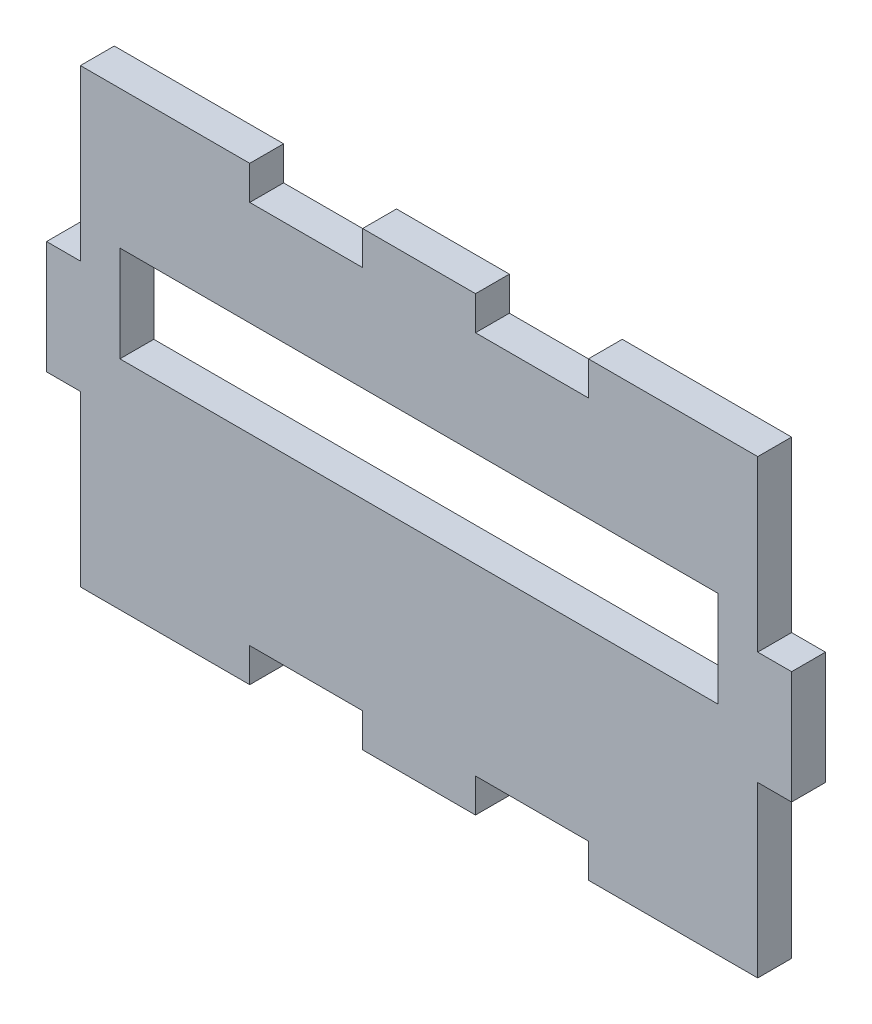
ISO-10303-21;
HEADER;
FILE_DESCRIPTION(('STEP AP214'),'2;1');
FILE_NAME('part.step','',(''),(''),'','','');
FILE_SCHEMA(('AUTOMOTIVE_DESIGN { 1 0 10303 214 1 1 1 1 }'));
ENDSEC;
DATA;
#1=APPLICATION_CONTEXT('core data for automotive mechanical design processes');
#2=APPLICATION_PROTOCOL_DEFINITION('international standard','automotive_design',2000,#1);
#3=PRODUCT_CONTEXT('',#1,'mechanical');
#4=PRODUCT('Part','Part','',(#3));
#5=PRODUCT_RELATED_PRODUCT_CATEGORY('part','',(#4));
#6=PRODUCT_DEFINITION_FORMATION('','',#4);
#7=PRODUCT_DEFINITION_CONTEXT('part definition',#1,'design');
#8=PRODUCT_DEFINITION('design','',#6,#7);
#9=PRODUCT_DEFINITION_SHAPE('','',#8);
#10=(LENGTH_UNIT() NAMED_UNIT(*) SI_UNIT(.MILLI.,.METRE.));
#11=(NAMED_UNIT(*) PLANE_ANGLE_UNIT() SI_UNIT($,.RADIAN.));
#12=(NAMED_UNIT(*) SI_UNIT($,.STERADIAN.) SOLID_ANGLE_UNIT());
#13=UNCERTAINTY_MEASURE_WITH_UNIT(LENGTH_MEASURE(1.E-05),#10,'distance_accuracy_value','');
#14=(GEOMETRIC_REPRESENTATION_CONTEXT(3) GLOBAL_UNCERTAINTY_ASSIGNED_CONTEXT((#13)) GLOBAL_UNIT_ASSIGNED_CONTEXT((#10,
#11,#12)) REPRESENTATION_CONTEXT('',''));
#15=CARTESIAN_POINT('',(0.,0.,0.));
#16=DIRECTION('',(0.,0.,1.));
#17=DIRECTION('',(1.,0.,0.));
#18=AXIS2_PLACEMENT_3D('',#15,#16,#17);
#19=CARTESIAN_POINT('',(0.,0.,6.));
#20=DIRECTION('',(0.,0.,1.));
#21=DIRECTION('',(1.,0.,0.));
#22=AXIS2_PLACEMENT_3D('',#19,#20,#21);
#23=PLANE('',#22);
#24=DIRECTION('',(1.,0.,0.));
#25=VECTOR('',#24,1.);
#26=CARTESIAN_POINT('',(0.,0.,6.));
#27=LINE('',#26,#25);
#28=CARTESIAN_POINT('',(-30.0000752126141,0.,6.));
#29=VERTEX_POINT('',#28);
#30=CARTESIAN_POINT('',(0.,0.,6.));
#31=VERTEX_POINT('',#30);
#32=EDGE_CURVE('E278',#29,#31,#27,.T.);
#33=ORIENTED_EDGE('',*,*,#32,.T.);
#34=DIRECTION('',(0.,1.,0.));
#35=VECTOR('',#34,1.);
#36=CARTESIAN_POINT('',(0.,0.,6.));
#37=LINE('',#36,#35);
#38=CARTESIAN_POINT('',(0.,30.,6.));
#39=VERTEX_POINT('',#38);
#40=EDGE_CURVE('E281',#31,#39,#37,.T.);
#41=ORIENTED_EDGE('',*,*,#40,.T.);
#42=DIRECTION('',(1.,0.,0.));
#43=VECTOR('',#42,1.);
#44=CARTESIAN_POINT('',(5.99999999999999,30.,6.));
#45=LINE('',#44,#43);
#46=CARTESIAN_POINT('',(5.99999999999999,30.,6.));
#47=VERTEX_POINT('',#46);
#48=EDGE_CURVE('E284',#39,#47,#45,.T.);
#49=ORIENTED_EDGE('',*,*,#48,.T.);
#50=DIRECTION('',(0.,1.,0.));
#51=VECTOR('',#50,1.);
#52=CARTESIAN_POINT('',(5.99999999999999,50.,6.));
#53=LINE('',#52,#51);
#54=CARTESIAN_POINT('',(5.99999999999999,50.,6.));
#55=VERTEX_POINT('',#54);
#56=EDGE_CURVE('E286',#47,#55,#53,.T.);
#57=ORIENTED_EDGE('',*,*,#56,.T.);
#58=DIRECTION('',(-1.,0.,0.));
#59=VECTOR('',#58,1.);
#60=CARTESIAN_POINT('',(0.,50.,6.));
#61=LINE('',#60,#59);
#62=CARTESIAN_POINT('',(0.,50.,6.));
#63=VERTEX_POINT('',#62);
#64=EDGE_CURVE('E288',#55,#63,#61,.T.);
#65=ORIENTED_EDGE('',*,*,#64,.T.);
#66=DIRECTION('',(0.,1.,0.));
#67=VECTOR('',#66,1.);
#68=CARTESIAN_POINT('',(0.,50.,6.));
#69=LINE('',#68,#67);
#70=CARTESIAN_POINT('',(0.,80.,6.));
#71=VERTEX_POINT('',#70);
#72=EDGE_CURVE('E290',#63,#71,#69,.T.);
#73=ORIENTED_EDGE('',*,*,#72,.T.);
#74=DIRECTION('',(-1.,0.,0.));
#75=VECTOR('',#74,1.);
#76=CARTESIAN_POINT('',(0.,80.,6.));
#77=LINE('',#76,#75);
#78=CARTESIAN_POINT('',(-30.0000005839988,80.,6.));
#79=VERTEX_POINT('',#78);
#80=EDGE_CURVE('E292',#71,#79,#77,.T.);
#81=ORIENTED_EDGE('',*,*,#80,.T.);
#82=DIRECTION('',(0.,-1.,0.));
#83=VECTOR('',#82,1.);
#84=CARTESIAN_POINT('',(-30.0000005839988,74.,6.));
#85=LINE('',#84,#83);
#86=CARTESIAN_POINT('',(-30.0000005839988,74.,6.));
#87=VERTEX_POINT('',#86);
#88=EDGE_CURVE('E294',#79,#87,#85,.T.);
#89=ORIENTED_EDGE('',*,*,#88,.T.);
#90=DIRECTION('',(-1.,0.,0.));
#91=VECTOR('',#90,1.);
#92=CARTESIAN_POINT('',(-50.0000005839988,74.,6.));
#93=LINE('',#92,#91);
#94=CARTESIAN_POINT('',(-50.0000005839988,74.,6.));
#95=VERTEX_POINT('',#94);
#96=EDGE_CURVE('E296',#87,#95,#93,.T.);
#97=ORIENTED_EDGE('',*,*,#96,.T.);
#98=DIRECTION('',(9.73331288252792E-08,0.999999999999995,0.));
#99=VECTOR('',#98,1.);
#100=CARTESIAN_POINT('',(-50.,80.,6.));
#101=LINE('',#100,#99);
#102=CARTESIAN_POINT('',(-50.,80.,6.));
#103=VERTEX_POINT('',#102);
#104=EDGE_CURVE('E298',#95,#103,#101,.T.);
#105=ORIENTED_EDGE('',*,*,#104,.T.);
#106=DIRECTION('',(-1.,0.,0.));
#107=VECTOR('',#106,1.);
#108=CARTESIAN_POINT('',(-50.,80.,6.));
#109=LINE('',#108,#107);
#110=CARTESIAN_POINT('',(-70.,80.,6.));
#111=VERTEX_POINT('',#110);
#112=EDGE_CURVE('E300',#103,#111,#109,.T.);
#113=ORIENTED_EDGE('',*,*,#112,.T.);
#114=DIRECTION('',(0.,-1.,0.));
#115=VECTOR('',#114,1.);
#116=CARTESIAN_POINT('',(-70.,74.,6.));
#117=LINE('',#116,#115);
#118=CARTESIAN_POINT('',(-70.,74.,6.));
#119=VERTEX_POINT('',#118);
#120=EDGE_CURVE('E302',#111,#119,#117,.T.);
#121=ORIENTED_EDGE('',*,*,#120,.T.);
#122=DIRECTION('',(-1.,0.,0.));
#123=VECTOR('',#122,1.);
#124=CARTESIAN_POINT('',(-90.,74.,6.));
#125=LINE('',#124,#123);
#126=CARTESIAN_POINT('',(-90.,74.,6.));
#127=VERTEX_POINT('',#126);
#128=EDGE_CURVE('E304',#119,#127,#125,.T.);
#129=ORIENTED_EDGE('',*,*,#128,.T.);
#130=DIRECTION('',(9.73331299817613E-08,0.999999999999995,0.));
#131=VECTOR('',#130,1.);
#132=CARTESIAN_POINT('',(-89.9999994160012,80.,6.));
#133=LINE('',#132,#131);
#134=CARTESIAN_POINT('',(-89.9999994160012,80.,6.));
#135=VERTEX_POINT('',#134);
#136=EDGE_CURVE('E306',#127,#135,#133,.T.);
#137=ORIENTED_EDGE('',*,*,#136,.T.);
#138=DIRECTION('',(-1.,0.,0.));
#139=VECTOR('',#138,1.);
#140=CARTESIAN_POINT('',(-89.9999994160012,80.,6.));
#141=LINE('',#140,#139);
#142=CARTESIAN_POINT('',(-120.,80.,6.));
#143=VERTEX_POINT('',#142);
#144=EDGE_CURVE('E308',#135,#143,#141,.T.);
#145=ORIENTED_EDGE('',*,*,#144,.T.);
#146=DIRECTION('',(0.,-1.,0.));
#147=VECTOR('',#146,1.);
#148=CARTESIAN_POINT('',(-120.,50.,6.));
#149=LINE('',#148,#147);
#150=CARTESIAN_POINT('',(-120.,50.,6.));
#151=VERTEX_POINT('',#150);
#152=EDGE_CURVE('E310',#143,#151,#149,.T.);
#153=ORIENTED_EDGE('',*,*,#152,.T.);
#154=DIRECTION('',(-1.,0.,0.));
#155=VECTOR('',#154,1.);
#156=CARTESIAN_POINT('',(-120.,50.,6.));
#157=LINE('',#156,#155);
#158=CARTESIAN_POINT('',(-126.,50.,6.));
#159=VERTEX_POINT('',#158);
#160=EDGE_CURVE('E312',#151,#159,#157,.T.);
#161=ORIENTED_EDGE('',*,*,#160,.T.);
#162=DIRECTION('',(0.,-1.,0.));
#163=VECTOR('',#162,1.);
#164=CARTESIAN_POINT('',(-126.,50.,6.));
#165=LINE('',#164,#163);
#166=CARTESIAN_POINT('',(-126.,30.,6.));
#167=VERTEX_POINT('',#166);
#168=EDGE_CURVE('E314',#159,#167,#165,.T.);
#169=ORIENTED_EDGE('',*,*,#168,.T.);
#170=DIRECTION('',(1.,0.,0.));
#171=VECTOR('',#170,1.);
#172=CARTESIAN_POINT('',(-126.,30.,6.));
#173=LINE('',#172,#171);
#174=CARTESIAN_POINT('',(-120.,30.,6.));
#175=VERTEX_POINT('',#174);
#176=EDGE_CURVE('E316',#167,#175,#173,.T.);
#177=ORIENTED_EDGE('',*,*,#176,.T.);
#178=DIRECTION('',(0.,-1.,0.));
#179=VECTOR('',#178,1.);
#180=CARTESIAN_POINT('',(-120.,0.,6.));
#181=LINE('',#180,#179);
#182=CARTESIAN_POINT('',(-120.,0.,6.));
#183=VERTEX_POINT('',#182);
#184=EDGE_CURVE('E318',#175,#183,#181,.T.);
#185=ORIENTED_EDGE('',*,*,#184,.T.);
#186=DIRECTION('',(1.,0.,0.));
#187=VECTOR('',#186,1.);
#188=CARTESIAN_POINT('',(-89.9999994160012,0.,6.));
#189=LINE('',#188,#187);
#190=CARTESIAN_POINT('',(-89.9999994160012,0.,6.));
#191=VERTEX_POINT('',#190);
#192=EDGE_CURVE('E320',#183,#191,#189,.T.);
#193=ORIENTED_EDGE('',*,*,#192,.T.);
#194=DIRECTION('',(0.,1.,0.));
#195=VECTOR('',#194,1.);
#196=CARTESIAN_POINT('',(-89.9999994160012,0.,6.));
#197=LINE('',#196,#195);
#198=CARTESIAN_POINT('',(-89.9999994160012,5.99999999999999,6.));
#199=VERTEX_POINT('',#198);
#200=EDGE_CURVE('E322',#191,#199,#197,.T.);
#201=ORIENTED_EDGE('',*,*,#200,.T.);
#202=DIRECTION('',(1.,0.,0.));
#203=VECTOR('',#202,1.);
#204=CARTESIAN_POINT('',(-89.9999994160012,5.99999999999999,6.));
#205=LINE('',#204,#203);
#206=CARTESIAN_POINT('',(-69.9999994160012,5.99999999999999,6.));
#207=VERTEX_POINT('',#206);
#208=EDGE_CURVE('E324',#199,#207,#205,.T.);
#209=ORIENTED_EDGE('',*,*,#208,.T.);
#210=DIRECTION('',(0.,-1.,0.));
#211=VECTOR('',#210,1.);
#212=CARTESIAN_POINT('',(-69.9999994160012,5.99999999999999,6.));
#213=LINE('',#212,#211);
#214=CARTESIAN_POINT('',(-69.9999994160012,0.,6.));
#215=VERTEX_POINT('',#214);
#216=EDGE_CURVE('E326',#207,#215,#213,.T.);
#217=ORIENTED_EDGE('',*,*,#216,.T.);
#218=DIRECTION('',(1.,0.,0.));
#219=VECTOR('',#218,1.);
#220=CARTESIAN_POINT('',(-50.0000752126141,0.,6.));
#221=LINE('',#220,#219);
#222=CARTESIAN_POINT('',(-50.0000752126141,0.,6.));
#223=VERTEX_POINT('',#222);
#224=EDGE_CURVE('E328',#215,#223,#221,.T.);
#225=ORIENTED_EDGE('',*,*,#224,.T.);
#226=DIRECTION('',(0.,1.,0.));
#227=VECTOR('',#226,1.);
#228=CARTESIAN_POINT('',(-50.0000752126141,0.,6.));
#229=LINE('',#228,#227);
#230=CARTESIAN_POINT('',(-50.0000752126141,5.99999999999999,6.));
#231=VERTEX_POINT('',#230);
#232=EDGE_CURVE('E330',#223,#231,#229,.T.);
#233=ORIENTED_EDGE('',*,*,#232,.T.);
#234=DIRECTION('',(1.,0.,0.));
#235=VECTOR('',#234,1.);
#236=CARTESIAN_POINT('',(-50.0000752126141,5.99999999999999,6.));
#237=LINE('',#236,#235);
#238=CARTESIAN_POINT('',(-30.0000752126141,5.99999999999999,6.));
#239=VERTEX_POINT('',#238);
#240=EDGE_CURVE('E332',#231,#239,#237,.T.);
#241=ORIENTED_EDGE('',*,*,#240,.T.);
#242=DIRECTION('',(0.,-1.,0.));
#243=VECTOR('',#242,1.);
#244=CARTESIAN_POINT('',(-30.0000752126141,5.99999999999999,6.));
#245=LINE('',#244,#243);
#246=EDGE_CURVE('E334',#239,#29,#245,.T.);
#247=ORIENTED_EDGE('',*,*,#246,.T.);
#248=EDGE_LOOP('',(#33,#41,#49,#57,#65,#73,#81,#89,#97,#105,#113,#121,#129,#137,#145,#153,#161,
#169,#177,#185,#193,#201,#209,#217,#225,#233,#241,#247));
#249=FACE_BOUND('',#248,.T.);
#250=DIRECTION('',(1.,0.,0.));
#251=VECTOR('',#250,1.);
#252=CARTESIAN_POINT('',(-113.,38.5,6.));
#253=LINE('',#252,#251);
#254=CARTESIAN_POINT('',(-113.,38.5,6.));
#255=VERTEX_POINT('',#254);
#256=CARTESIAN_POINT('',(-6.99999999999998,38.5,6.));
#257=VERTEX_POINT('',#256);
#258=EDGE_CURVE('E250',#255,#257,#253,.T.);
#259=ORIENTED_EDGE('',*,*,#258,.F.);
#260=DIRECTION('',(0.,-1.,0.));
#261=VECTOR('',#260,1.);
#262=CARTESIAN_POINT('',(-113.,38.5,6.));
#263=LINE('',#262,#261);
#264=CARTESIAN_POINT('',(-113.,55.5,6.));
#265=VERTEX_POINT('',#264);
#266=EDGE_CURVE('E242',#265,#255,#263,.T.);
#267=ORIENTED_EDGE('',*,*,#266,.F.);
#268=DIRECTION('',(-1.,0.,0.));
#269=VECTOR('',#268,1.);
#270=CARTESIAN_POINT('',(-113.,55.5,6.));
#271=LINE('',#270,#269);
#272=CARTESIAN_POINT('',(-6.99999999999998,55.5,6.));
#273=VERTEX_POINT('',#272);
#274=EDGE_CURVE('E264',#273,#265,#271,.T.);
#275=ORIENTED_EDGE('',*,*,#274,.F.);
#276=DIRECTION('',(0.,1.,0.));
#277=VECTOR('',#276,1.);
#278=CARTESIAN_POINT('',(-6.99999999999998,38.5,6.));
#279=LINE('',#278,#277);
#280=EDGE_CURVE('E262',#257,#273,#279,.T.);
#281=ORIENTED_EDGE('',*,*,#280,.F.);
#282=EDGE_LOOP('',(#259,#267,#275,#281));
#283=FACE_BOUND('',#282,.T.);
#284=ADVANCED_FACE('F33',(#249,#283),#23,.T.);
#285=CARTESIAN_POINT('',(0.,0.,0.));
#286=DIRECTION('',(0.,0.,1.));
#287=DIRECTION('',(1.,0.,0.));
#288=AXIS2_PLACEMENT_3D('',#285,#286,#287);
#289=PLANE('',#288);
#290=DIRECTION('',(1.,0.,0.));
#291=VECTOR('',#290,1.);
#292=CARTESIAN_POINT('',(0.,0.,0.));
#293=LINE('',#292,#291);
#294=CARTESIAN_POINT('',(-30.0000752126141,0.,0.));
#295=VERTEX_POINT('',#294);
#296=CARTESIAN_POINT('',(0.,0.,0.));
#297=VERTEX_POINT('',#296);
#298=EDGE_CURVE('E258',#295,#297,#293,.T.);
#299=ORIENTED_EDGE('',*,*,#298,.F.);
#300=DIRECTION('',(0.,-1.,0.));
#301=VECTOR('',#300,1.);
#302=CARTESIAN_POINT('',(-30.0000752126141,5.99999999999999,0.));
#303=LINE('',#302,#301);
#304=CARTESIAN_POINT('',(-30.0000752126141,5.99999999999999,0.));
#305=VERTEX_POINT('',#304);
#306=EDGE_CURVE('E282',#305,#295,#303,.T.);
#307=ORIENTED_EDGE('',*,*,#306,.F.);
#308=DIRECTION('',(1.,0.,0.));
#309=VECTOR('',#308,1.);
#310=CARTESIAN_POINT('',(-50.0000752126141,5.99999999999999,0.));
#311=LINE('',#310,#309);
#312=CARTESIAN_POINT('',(-50.0000752126141,5.99999999999999,0.));
#313=VERTEX_POINT('',#312);
#314=EDGE_CURVE('E389',#313,#305,#311,.T.);
#315=ORIENTED_EDGE('',*,*,#314,.F.);
#316=DIRECTION('',(0.,1.,0.));
#317=VECTOR('',#316,1.);
#318=CARTESIAN_POINT('',(-50.0000752126141,0.,0.));
#319=LINE('',#318,#317);
#320=CARTESIAN_POINT('',(-50.0000752126141,0.,0.));
#321=VERTEX_POINT('',#320);
#322=EDGE_CURVE('E387',#321,#313,#319,.T.);
#323=ORIENTED_EDGE('',*,*,#322,.F.);
#324=DIRECTION('',(1.,0.,0.));
#325=VECTOR('',#324,1.);
#326=CARTESIAN_POINT('',(-50.0000752126141,0.,0.));
#327=LINE('',#326,#325);
#328=CARTESIAN_POINT('',(-69.9999994160012,0.,0.));
#329=VERTEX_POINT('',#328);
#330=EDGE_CURVE('E385',#329,#321,#327,.T.);
#331=ORIENTED_EDGE('',*,*,#330,.F.);
#332=DIRECTION('',(0.,-1.,0.));
#333=VECTOR('',#332,1.);
#334=CARTESIAN_POINT('',(-69.9999994160012,5.99999999999999,0.));
#335=LINE('',#334,#333);
#336=CARTESIAN_POINT('',(-69.9999994160012,5.99999999999999,0.));
#337=VERTEX_POINT('',#336);
#338=EDGE_CURVE('E383',#337,#329,#335,.T.);
#339=ORIENTED_EDGE('',*,*,#338,.F.);
#340=DIRECTION('',(1.,0.,0.));
#341=VECTOR('',#340,1.);
#342=CARTESIAN_POINT('',(-89.9999994160012,5.99999999999999,0.));
#343=LINE('',#342,#341);
#344=CARTESIAN_POINT('',(-89.9999994160012,5.99999999999999,0.));
#345=VERTEX_POINT('',#344);
#346=EDGE_CURVE('E381',#345,#337,#343,.T.);
#347=ORIENTED_EDGE('',*,*,#346,.F.);
#348=DIRECTION('',(0.,1.,0.));
#349=VECTOR('',#348,1.);
#350=CARTESIAN_POINT('',(-89.9999994160012,0.,0.));
#351=LINE('',#350,#349);
#352=CARTESIAN_POINT('',(-89.9999994160012,0.,0.));
#353=VERTEX_POINT('',#352);
#354=EDGE_CURVE('E379',#353,#345,#351,.T.);
#355=ORIENTED_EDGE('',*,*,#354,.F.);
#356=DIRECTION('',(1.,0.,0.));
#357=VECTOR('',#356,1.);
#358=CARTESIAN_POINT('',(-89.9999994160012,0.,0.));
#359=LINE('',#358,#357);
#360=CARTESIAN_POINT('',(-120.,0.,0.));
#361=VERTEX_POINT('',#360);
#362=EDGE_CURVE('E377',#361,#353,#359,.T.);
#363=ORIENTED_EDGE('',*,*,#362,.F.);
#364=DIRECTION('',(0.,-1.,0.));
#365=VECTOR('',#364,1.);
#366=CARTESIAN_POINT('',(-120.,0.,0.));
#367=LINE('',#366,#365);
#368=CARTESIAN_POINT('',(-120.,30.,0.));
#369=VERTEX_POINT('',#368);
#370=EDGE_CURVE('E375',#369,#361,#367,.T.);
#371=ORIENTED_EDGE('',*,*,#370,.F.);
#372=DIRECTION('',(1.,0.,0.));
#373=VECTOR('',#372,1.);
#374=CARTESIAN_POINT('',(-126.,30.,0.));
#375=LINE('',#374,#373);
#376=CARTESIAN_POINT('',(-126.,30.,0.));
#377=VERTEX_POINT('',#376);
#378=EDGE_CURVE('E373',#377,#369,#375,.T.);
#379=ORIENTED_EDGE('',*,*,#378,.F.);
#380=DIRECTION('',(0.,-1.,0.));
#381=VECTOR('',#380,1.);
#382=CARTESIAN_POINT('',(-126.,50.,0.));
#383=LINE('',#382,#381);
#384=CARTESIAN_POINT('',(-126.,50.,0.));
#385=VERTEX_POINT('',#384);
#386=EDGE_CURVE('E371',#385,#377,#383,.T.);
#387=ORIENTED_EDGE('',*,*,#386,.F.);
#388=DIRECTION('',(-1.,0.,0.));
#389=VECTOR('',#388,1.);
#390=CARTESIAN_POINT('',(-120.,50.,0.));
#391=LINE('',#390,#389);
#392=CARTESIAN_POINT('',(-120.,50.,0.));
#393=VERTEX_POINT('',#392);
#394=EDGE_CURVE('E369',#393,#385,#391,.T.);
#395=ORIENTED_EDGE('',*,*,#394,.F.);
#396=DIRECTION('',(0.,-1.,0.));
#397=VECTOR('',#396,1.);
#398=CARTESIAN_POINT('',(-120.,50.,0.));
#399=LINE('',#398,#397);
#400=CARTESIAN_POINT('',(-120.,80.,0.));
#401=VERTEX_POINT('',#400);
#402=EDGE_CURVE('E367',#401,#393,#399,.T.);
#403=ORIENTED_EDGE('',*,*,#402,.F.);
#404=DIRECTION('',(-1.,0.,0.));
#405=VECTOR('',#404,1.);
#406=CARTESIAN_POINT('',(-89.9999994160012,80.,0.));
#407=LINE('',#406,#405);
#408=CARTESIAN_POINT('',(-89.9999994160012,80.,0.));
#409=VERTEX_POINT('',#408);
#410=EDGE_CURVE('E365',#409,#401,#407,.T.);
#411=ORIENTED_EDGE('',*,*,#410,.F.);
#412=DIRECTION('',(9.73331299817613E-08,0.999999999999995,0.));
#413=VECTOR('',#412,1.);
#414=CARTESIAN_POINT('',(-89.9999994160012,80.,0.));
#415=LINE('',#414,#413);
#416=CARTESIAN_POINT('',(-90.,74.,0.));
#417=VERTEX_POINT('',#416);
#418=EDGE_CURVE('E363',#417,#409,#415,.T.);
#419=ORIENTED_EDGE('',*,*,#418,.F.);
#420=DIRECTION('',(-1.,0.,0.));
#421=VECTOR('',#420,1.);
#422=CARTESIAN_POINT('',(-90.,74.,0.));
#423=LINE('',#422,#421);
#424=CARTESIAN_POINT('',(-70.,74.,0.));
#425=VERTEX_POINT('',#424);
#426=EDGE_CURVE('E361',#425,#417,#423,.T.);
#427=ORIENTED_EDGE('',*,*,#426,.F.);
#428=DIRECTION('',(0.,-1.,0.));
#429=VECTOR('',#428,1.);
#430=CARTESIAN_POINT('',(-70.,74.,0.));
#431=LINE('',#430,#429);
#432=CARTESIAN_POINT('',(-70.,80.,0.));
#433=VERTEX_POINT('',#432);
#434=EDGE_CURVE('E359',#433,#425,#431,.T.);
#435=ORIENTED_EDGE('',*,*,#434,.F.);
#436=DIRECTION('',(-1.,0.,0.));
#437=VECTOR('',#436,1.);
#438=CARTESIAN_POINT('',(-50.,80.,0.));
#439=LINE('',#438,#437);
#440=CARTESIAN_POINT('',(-50.,80.,0.));
#441=VERTEX_POINT('',#440);
#442=EDGE_CURVE('E357',#441,#433,#439,.T.);
#443=ORIENTED_EDGE('',*,*,#442,.F.);
#444=DIRECTION('',(9.73331288252792E-08,0.999999999999995,0.));
#445=VECTOR('',#444,1.);
#446=CARTESIAN_POINT('',(-50.,80.,0.));
#447=LINE('',#446,#445);
#448=CARTESIAN_POINT('',(-50.0000005839988,74.,0.));
#449=VERTEX_POINT('',#448);
#450=EDGE_CURVE('E355',#449,#441,#447,.T.);
#451=ORIENTED_EDGE('',*,*,#450,.F.);
#452=DIRECTION('',(-1.,0.,0.));
#453=VECTOR('',#452,1.);
#454=CARTESIAN_POINT('',(-50.0000005839988,74.,0.));
#455=LINE('',#454,#453);
#456=CARTESIAN_POINT('',(-30.0000005839988,74.,0.));
#457=VERTEX_POINT('',#456);
#458=EDGE_CURVE('E353',#457,#449,#455,.T.);
#459=ORIENTED_EDGE('',*,*,#458,.F.);
#460=DIRECTION('',(0.,-1.,0.));
#461=VECTOR('',#460,1.);
#462=CARTESIAN_POINT('',(-30.0000005839988,74.,0.));
#463=LINE('',#462,#461);
#464=CARTESIAN_POINT('',(-30.0000005839988,80.,0.));
#465=VERTEX_POINT('',#464);
#466=EDGE_CURVE('E351',#465,#457,#463,.T.);
#467=ORIENTED_EDGE('',*,*,#466,.F.);
#468=DIRECTION('',(-1.,0.,0.));
#469=VECTOR('',#468,1.);
#470=CARTESIAN_POINT('',(0.,80.,0.));
#471=LINE('',#470,#469);
#472=CARTESIAN_POINT('',(0.,80.,0.));
#473=VERTEX_POINT('',#472);
#474=EDGE_CURVE('E349',#473,#465,#471,.T.);
#475=ORIENTED_EDGE('',*,*,#474,.F.);
#476=DIRECTION('',(0.,1.,0.));
#477=VECTOR('',#476,1.);
#478=CARTESIAN_POINT('',(0.,50.,0.));
#479=LINE('',#478,#477);
#480=CARTESIAN_POINT('',(0.,50.,0.));
#481=VERTEX_POINT('',#480);
#482=EDGE_CURVE('E347',#481,#473,#479,.T.);
#483=ORIENTED_EDGE('',*,*,#482,.F.);
#484=DIRECTION('',(-1.,0.,0.));
#485=VECTOR('',#484,1.);
#486=CARTESIAN_POINT('',(0.,50.,0.));
#487=LINE('',#486,#485);
#488=CARTESIAN_POINT('',(5.99999999999999,50.,0.));
#489=VERTEX_POINT('',#488);
#490=EDGE_CURVE('E345',#489,#481,#487,.T.);
#491=ORIENTED_EDGE('',*,*,#490,.F.);
#492=DIRECTION('',(0.,1.,0.));
#493=VECTOR('',#492,1.);
#494=CARTESIAN_POINT('',(5.99999999999999,50.,0.));
#495=LINE('',#494,#493);
#496=CARTESIAN_POINT('',(5.99999999999999,30.,0.));
#497=VERTEX_POINT('',#496);
#498=EDGE_CURVE('E343',#497,#489,#495,.T.);
#499=ORIENTED_EDGE('',*,*,#498,.F.);
#500=DIRECTION('',(1.,0.,0.));
#501=VECTOR('',#500,1.);
#502=CARTESIAN_POINT('',(5.99999999999999,30.,0.));
#503=LINE('',#502,#501);
#504=CARTESIAN_POINT('',(0.,30.,0.));
#505=VERTEX_POINT('',#504);
#506=EDGE_CURVE('E341',#505,#497,#503,.T.);
#507=ORIENTED_EDGE('',*,*,#506,.F.);
#508=DIRECTION('',(0.,1.,0.));
#509=VECTOR('',#508,1.);
#510=CARTESIAN_POINT('',(0.,0.,0.));
#511=LINE('',#510,#509);
#512=EDGE_CURVE('E339',#297,#505,#511,.T.);
#513=ORIENTED_EDGE('',*,*,#512,.F.);
#514=EDGE_LOOP('',(#299,#307,#315,#323,#331,#339,#347,#355,#363,#371,#379,#387,#395,#403,#411,
#419,#427,#435,#443,#451,#459,#467,#475,#483,#491,#499,#507,#513));
#515=FACE_BOUND('',#514,.T.);
#516=DIRECTION('',(0.,-1.,0.));
#517=VECTOR('',#516,1.);
#518=CARTESIAN_POINT('',(-113.,38.5,0.));
#519=LINE('',#518,#517);
#520=CARTESIAN_POINT('',(-113.,55.5,0.));
#521=VERTEX_POINT('',#520);
#522=CARTESIAN_POINT('',(-113.,38.5,0.));
#523=VERTEX_POINT('',#522);
#524=EDGE_CURVE('E56',#521,#523,#519,.T.);
#525=ORIENTED_EDGE('',*,*,#524,.T.);
#526=DIRECTION('',(1.,0.,0.));
#527=VECTOR('',#526,1.);
#528=CARTESIAN_POINT('',(-113.,38.5,0.));
#529=LINE('',#528,#527);
#530=CARTESIAN_POINT('',(-6.99999999999998,38.5,0.));
#531=VERTEX_POINT('',#530);
#532=EDGE_CURVE('E257',#523,#531,#529,.T.);
#533=ORIENTED_EDGE('',*,*,#532,.T.);
#534=DIRECTION('',(0.,1.,0.));
#535=VECTOR('',#534,1.);
#536=CARTESIAN_POINT('',(-6.99999999999998,38.5,0.));
#537=LINE('',#536,#535);
#538=CARTESIAN_POINT('',(-6.99999999999998,55.5,0.));
#539=VERTEX_POINT('',#538);
#540=EDGE_CURVE('E270',#531,#539,#537,.T.);
#541=ORIENTED_EDGE('',*,*,#540,.T.);
#542=DIRECTION('',(-1.,0.,0.));
#543=VECTOR('',#542,1.);
#544=CARTESIAN_POINT('',(-113.,55.5,0.));
#545=LINE('',#544,#543);
#546=EDGE_CURVE('E251',#539,#521,#545,.T.);
#547=ORIENTED_EDGE('',*,*,#546,.T.);
#548=EDGE_LOOP('',(#525,#533,#541,#547));
#549=FACE_BOUND('',#548,.T.);
#550=ADVANCED_FACE('F479',(#515,#549),#289,.F.);
#551=CARTESIAN_POINT('',(0.,0.,6.));
#552=DIRECTION('',(0.,1.,0.));
#553=DIRECTION('',(-1.,0.,0.));
#554=AXIS2_PLACEMENT_3D('',#551,#552,#553);
#555=PLANE('',#554);
#556=ORIENTED_EDGE('',*,*,#298,.T.);
#557=DIRECTION('',(0.,0.,-1.));
#558=VECTOR('',#557,1.);
#559=CARTESIAN_POINT('',(0.,0.,6.));
#560=LINE('',#559,#558);
#561=EDGE_CURVE('E11',#31,#297,#560,.T.);
#562=ORIENTED_EDGE('',*,*,#561,.F.);
#563=ORIENTED_EDGE('',*,*,#32,.F.);
#564=DIRECTION('',(0.,0.,-1.));
#565=VECTOR('',#564,1.);
#566=CARTESIAN_POINT('',(-30.0000752126141,0.,6.));
#567=LINE('',#566,#565);
#568=EDGE_CURVE('E336',#29,#295,#567,.T.);
#569=ORIENTED_EDGE('',*,*,#568,.T.);
#570=EDGE_LOOP('',(#556,#562,#563,#569));
#571=FACE_BOUND('',#570,.T.);
#572=ADVANCED_FACE('F35',(#571),#555,.F.);
#573=CARTESIAN_POINT('',(0.,0.,6.));
#574=DIRECTION('',(-1.,0.,0.));
#575=DIRECTION('',(0.,0.,1.));
#576=AXIS2_PLACEMENT_3D('',#573,#574,#575);
#577=PLANE('',#576);
#578=ORIENTED_EDGE('',*,*,#512,.T.);
#579=DIRECTION('',(0.,0.,-1.));
#580=VECTOR('',#579,1.);
#581=CARTESIAN_POINT('',(0.,30.,6.));
#582=LINE('',#581,#580);
#583=EDGE_CURVE('E41',#39,#505,#582,.T.);
#584=ORIENTED_EDGE('',*,*,#583,.F.);
#585=ORIENTED_EDGE('',*,*,#40,.F.);
#586=ORIENTED_EDGE('',*,*,#561,.T.);
#587=EDGE_LOOP('',(#578,#584,#585,#586));
#588=FACE_BOUND('',#587,.T.);
#589=ADVANCED_FACE('F496',(#588),#577,.F.);
#590=CARTESIAN_POINT('',(5.99999999999999,30.,6.));
#591=DIRECTION('',(0.,1.,0.));
#592=DIRECTION('',(-1.,0.,0.));
#593=AXIS2_PLACEMENT_3D('',#590,#591,#592);
#594=PLANE('',#593);
#595=ORIENTED_EDGE('',*,*,#506,.T.);
#596=DIRECTION('',(0.,0.,-1.));
#597=VECTOR('',#596,1.);
#598=CARTESIAN_POINT('',(5.99999999999999,30.,6.));
#599=LINE('',#598,#597);
#600=EDGE_CURVE('E466',#47,#497,#599,.T.);
#601=ORIENTED_EDGE('',*,*,#600,.F.);
#602=ORIENTED_EDGE('',*,*,#48,.F.);
#603=ORIENTED_EDGE('',*,*,#583,.T.);
#604=EDGE_LOOP('',(#595,#601,#602,#603));
#605=FACE_BOUND('',#604,.T.);
#606=ADVANCED_FACE('F473',(#605),#594,.F.);
#607=CARTESIAN_POINT('',(5.99999999999999,50.,6.));
#608=DIRECTION('',(-1.,0.,0.));
#609=DIRECTION('',(0.,0.,1.));
#610=AXIS2_PLACEMENT_3D('',#607,#608,#609);
#611=PLANE('',#610);
#612=ORIENTED_EDGE('',*,*,#498,.T.);
#613=DIRECTION('',(0.,0.,-1.));
#614=VECTOR('',#613,1.);
#615=CARTESIAN_POINT('',(5.99999999999999,50.,6.));
#616=LINE('',#615,#614);
#617=EDGE_CURVE('E463',#55,#489,#616,.T.);
#618=ORIENTED_EDGE('',*,*,#617,.F.);
#619=ORIENTED_EDGE('',*,*,#56,.F.);
#620=ORIENTED_EDGE('',*,*,#600,.T.);
#621=EDGE_LOOP('',(#612,#618,#619,#620));
#622=FACE_BOUND('',#621,.T.);
#623=ADVANCED_FACE('F485',(#622),#611,.F.);
#624=CARTESIAN_POINT('',(0.,50.,6.));
#625=DIRECTION('',(0.,-1.,0.));
#626=DIRECTION('',(1.,0.,0.));
#627=AXIS2_PLACEMENT_3D('',#624,#625,#626);
#628=PLANE('',#627);
#629=ORIENTED_EDGE('',*,*,#490,.T.);
#630=DIRECTION('',(0.,0.,-1.));
#631=VECTOR('',#630,1.);
#632=CARTESIAN_POINT('',(0.,50.,6.));
#633=LINE('',#632,#631);
#634=EDGE_CURVE('E460',#63,#481,#633,.T.);
#635=ORIENTED_EDGE('',*,*,#634,.F.);
#636=ORIENTED_EDGE('',*,*,#64,.F.);
#637=ORIENTED_EDGE('',*,*,#617,.T.);
#638=EDGE_LOOP('',(#629,#635,#636,#637));
#639=FACE_BOUND('',#638,.T.);
#640=ADVANCED_FACE('F489',(#639),#628,.F.);
#641=CARTESIAN_POINT('',(0.,50.,6.));
#642=DIRECTION('',(-1.,0.,0.));
#643=DIRECTION('',(0.,0.,1.));
#644=AXIS2_PLACEMENT_3D('',#641,#642,#643);
#645=PLANE('',#644);
#646=ORIENTED_EDGE('',*,*,#482,.T.);
#647=DIRECTION('',(0.,0.,-1.));
#648=VECTOR('',#647,1.);
#649=CARTESIAN_POINT('',(0.,80.,6.));
#650=LINE('',#649,#648);
#651=EDGE_CURVE('E457',#71,#473,#650,.T.);
#652=ORIENTED_EDGE('',*,*,#651,.F.);
#653=ORIENTED_EDGE('',*,*,#72,.F.);
#654=ORIENTED_EDGE('',*,*,#634,.T.);
#655=EDGE_LOOP('',(#646,#652,#653,#654));
#656=FACE_BOUND('',#655,.T.);
#657=ADVANCED_FACE('F609',(#656),#645,.F.);
#658=CARTESIAN_POINT('',(0.,80.,6.));
#659=DIRECTION('',(0.,-1.,0.));
#660=DIRECTION('',(1.,0.,0.));
#661=AXIS2_PLACEMENT_3D('',#658,#659,#660);
#662=PLANE('',#661);
#663=ORIENTED_EDGE('',*,*,#474,.T.);
#664=DIRECTION('',(0.,0.,-1.));
#665=VECTOR('',#664,1.);
#666=CARTESIAN_POINT('',(-30.0000005839988,80.,6.));
#667=LINE('',#666,#665);
#668=EDGE_CURVE('E454',#79,#465,#667,.T.);
#669=ORIENTED_EDGE('',*,*,#668,.F.);
#670=ORIENTED_EDGE('',*,*,#80,.F.);
#671=ORIENTED_EDGE('',*,*,#651,.T.);
#672=EDGE_LOOP('',(#663,#669,#670,#671));
#673=FACE_BOUND('',#672,.T.);
#674=ADVANCED_FACE('F606',(#673),#662,.F.);
#675=CARTESIAN_POINT('',(-30.0000005839988,74.,6.));
#676=DIRECTION('',(1.,0.,0.));
#677=DIRECTION('',(0.,0.,-1.));
#678=AXIS2_PLACEMENT_3D('',#675,#676,#677);
#679=PLANE('',#678);
#680=ORIENTED_EDGE('',*,*,#466,.T.);
#681=DIRECTION('',(0.,0.,-1.));
#682=VECTOR('',#681,1.);
#683=CARTESIAN_POINT('',(-30.0000005839988,74.,6.));
#684=LINE('',#683,#682);
#685=EDGE_CURVE('E451',#87,#457,#684,.T.);
#686=ORIENTED_EDGE('',*,*,#685,.F.);
#687=ORIENTED_EDGE('',*,*,#88,.F.);
#688=ORIENTED_EDGE('',*,*,#668,.T.);
#689=EDGE_LOOP('',(#680,#686,#687,#688));
#690=FACE_BOUND('',#689,.T.);
#691=ADVANCED_FACE('F602',(#690),#679,.F.);
#692=CARTESIAN_POINT('',(-50.0000005839988,74.,6.));
#693=DIRECTION('',(0.,-1.,0.));
#694=DIRECTION('',(1.,0.,0.));
#695=AXIS2_PLACEMENT_3D('',#692,#693,#694);
#696=PLANE('',#695);
#697=ORIENTED_EDGE('',*,*,#458,.T.);
#698=DIRECTION('',(0.,0.,-1.));
#699=VECTOR('',#698,1.);
#700=CARTESIAN_POINT('',(-50.0000005839988,74.,6.));
#701=LINE('',#700,#699);
#702=EDGE_CURVE('E448',#95,#449,#701,.T.);
#703=ORIENTED_EDGE('',*,*,#702,.F.);
#704=ORIENTED_EDGE('',*,*,#96,.F.);
#705=ORIENTED_EDGE('',*,*,#685,.T.);
#706=EDGE_LOOP('',(#697,#703,#704,#705));
#707=FACE_BOUND('',#706,.T.);
#708=ADVANCED_FACE('F598',(#707),#696,.F.);
#709=CARTESIAN_POINT('',(-50.,80.,6.));
#710=DIRECTION('',(-0.999999999999995,9.73331288252792E-08,0.));
#711=DIRECTION('',(-9.73331288252792E-08,-0.999999999999995,0.));
#712=AXIS2_PLACEMENT_3D('',#709,#710,#711);
#713=PLANE('',#712);
#714=ORIENTED_EDGE('',*,*,#450,.T.);
#715=DIRECTION('',(0.,0.,-1.));
#716=VECTOR('',#715,1.);
#717=CARTESIAN_POINT('',(-50.,80.,6.));
#718=LINE('',#717,#716);
#719=EDGE_CURVE('E445',#103,#441,#718,.T.);
#720=ORIENTED_EDGE('',*,*,#719,.F.);
#721=ORIENTED_EDGE('',*,*,#104,.F.);
#722=ORIENTED_EDGE('',*,*,#702,.T.);
#723=EDGE_LOOP('',(#714,#720,#721,#722));
#724=FACE_BOUND('',#723,.T.);
#725=ADVANCED_FACE('F593',(#724),#713,.F.);
#726=CARTESIAN_POINT('',(-50.,80.,6.));
#727=DIRECTION('',(0.,-1.,0.));
#728=DIRECTION('',(0.,0.,-1.));
#729=AXIS2_PLACEMENT_3D('',#726,#727,#728);
#730=PLANE('',#729);
#731=ORIENTED_EDGE('',*,*,#442,.T.);
#732=DIRECTION('',(0.,0.,-1.));
#733=VECTOR('',#732,1.);
#734=CARTESIAN_POINT('',(-70.,80.,6.));
#735=LINE('',#734,#733);
#736=EDGE_CURVE('E442',#111,#433,#735,.T.);
#737=ORIENTED_EDGE('',*,*,#736,.F.);
#738=ORIENTED_EDGE('',*,*,#112,.F.);
#739=ORIENTED_EDGE('',*,*,#719,.T.);
#740=EDGE_LOOP('',(#731,#737,#738,#739));
#741=FACE_BOUND('',#740,.T.);
#742=ADVANCED_FACE('F587',(#741),#730,.F.);
#743=CARTESIAN_POINT('',(-70.,74.,6.));
#744=DIRECTION('',(1.,0.,0.));
#745=DIRECTION('',(0.,0.,-1.));
#746=AXIS2_PLACEMENT_3D('',#743,#744,#745);
#747=PLANE('',#746);
#748=ORIENTED_EDGE('',*,*,#434,.T.);
#749=DIRECTION('',(0.,0.,-1.));
#750=VECTOR('',#749,1.);
#751=CARTESIAN_POINT('',(-70.,74.,6.));
#752=LINE('',#751,#750);
#753=EDGE_CURVE('E439',#119,#425,#752,.T.);
#754=ORIENTED_EDGE('',*,*,#753,.F.);
#755=ORIENTED_EDGE('',*,*,#120,.F.);
#756=ORIENTED_EDGE('',*,*,#736,.T.);
#757=EDGE_LOOP('',(#748,#754,#755,#756));
#758=FACE_BOUND('',#757,.T.);
#759=ADVANCED_FACE('F583',(#758),#747,.F.);
#760=CARTESIAN_POINT('',(-90.,74.,6.));
#761=DIRECTION('',(0.,-1.,0.));
#762=DIRECTION('',(0.,0.,-1.));
#763=AXIS2_PLACEMENT_3D('',#760,#761,#762);
#764=PLANE('',#763);
#765=ORIENTED_EDGE('',*,*,#426,.T.);
#766=DIRECTION('',(0.,0.,-1.));
#767=VECTOR('',#766,1.);
#768=CARTESIAN_POINT('',(-90.,74.,6.));
#769=LINE('',#768,#767);
#770=EDGE_CURVE('E436',#127,#417,#769,.T.);
#771=ORIENTED_EDGE('',*,*,#770,.F.);
#772=ORIENTED_EDGE('',*,*,#128,.F.);
#773=ORIENTED_EDGE('',*,*,#753,.T.);
#774=EDGE_LOOP('',(#765,#771,#772,#773));
#775=FACE_BOUND('',#774,.T.);
#776=ADVANCED_FACE('F578',(#775),#764,.F.);
#777=CARTESIAN_POINT('',(-89.9999994160012,80.,6.));
#778=DIRECTION('',(-0.999999999999995,9.73331299817613E-08,0.));
#779=DIRECTION('',(-9.73331299817613E-08,-0.999999999999995,0.));
#780=AXIS2_PLACEMENT_3D('',#777,#778,#779);
#781=PLANE('',#780);
#782=ORIENTED_EDGE('',*,*,#418,.T.);
#783=DIRECTION('',(0.,0.,-1.));
#784=VECTOR('',#783,1.);
#785=CARTESIAN_POINT('',(-89.9999994160012,80.,6.));
#786=LINE('',#785,#784);
#787=EDGE_CURVE('E433',#135,#409,#786,.T.);
#788=ORIENTED_EDGE('',*,*,#787,.F.);
#789=ORIENTED_EDGE('',*,*,#136,.F.);
#790=ORIENTED_EDGE('',*,*,#770,.T.);
#791=EDGE_LOOP('',(#782,#788,#789,#790));
#792=FACE_BOUND('',#791,.T.);
#793=ADVANCED_FACE('F572',(#792),#781,.F.);
#794=CARTESIAN_POINT('',(-89.9999994160012,80.,6.));
#795=DIRECTION('',(0.,-1.,0.));
#796=DIRECTION('',(0.,0.,-1.));
#797=AXIS2_PLACEMENT_3D('',#794,#795,#796);
#798=PLANE('',#797);
#799=ORIENTED_EDGE('',*,*,#410,.T.);
#800=DIRECTION('',(0.,0.,-1.));
#801=VECTOR('',#800,1.);
#802=CARTESIAN_POINT('',(-120.,80.,6.));
#803=LINE('',#802,#801);
#804=EDGE_CURVE('E430',#143,#401,#803,.T.);
#805=ORIENTED_EDGE('',*,*,#804,.F.);
#806=ORIENTED_EDGE('',*,*,#144,.F.);
#807=ORIENTED_EDGE('',*,*,#787,.T.);
#808=EDGE_LOOP('',(#799,#805,#806,#807));
#809=FACE_BOUND('',#808,.T.);
#810=ADVANCED_FACE('F568',(#809),#798,.F.);
#811=CARTESIAN_POINT('',(-120.,50.,6.));
#812=DIRECTION('',(1.,0.,0.));
#813=DIRECTION('',(0.,1.,0.));
#814=AXIS2_PLACEMENT_3D('',#811,#812,#813);
#815=PLANE('',#814);
#816=ORIENTED_EDGE('',*,*,#402,.T.);
#817=DIRECTION('',(0.,0.,-1.));
#818=VECTOR('',#817,1.);
#819=CARTESIAN_POINT('',(-120.,50.,6.));
#820=LINE('',#819,#818);
#821=EDGE_CURVE('E427',#151,#393,#820,.T.);
#822=ORIENTED_EDGE('',*,*,#821,.F.);
#823=ORIENTED_EDGE('',*,*,#152,.F.);
#824=ORIENTED_EDGE('',*,*,#804,.T.);
#825=EDGE_LOOP('',(#816,#822,#823,#824));
#826=FACE_BOUND('',#825,.T.);
#827=ADVANCED_FACE('F563',(#826),#815,.F.);
#828=CARTESIAN_POINT('',(-120.,50.,6.));
#829=DIRECTION('',(0.,-1.,0.));
#830=DIRECTION('',(1.,0.,0.));
#831=AXIS2_PLACEMENT_3D('',#828,#829,#830);
#832=PLANE('',#831);
#833=ORIENTED_EDGE('',*,*,#394,.T.);
#834=DIRECTION('',(0.,0.,-1.));
#835=VECTOR('',#834,1.);
#836=CARTESIAN_POINT('',(-126.,50.,6.));
#837=LINE('',#836,#835);
#838=EDGE_CURVE('E424',#159,#385,#837,.T.);
#839=ORIENTED_EDGE('',*,*,#838,.F.);
#840=ORIENTED_EDGE('',*,*,#160,.F.);
#841=ORIENTED_EDGE('',*,*,#821,.T.);
#842=EDGE_LOOP('',(#833,#839,#840,#841));
#843=FACE_BOUND('',#842,.T.);
#844=ADVANCED_FACE('F557',(#843),#832,.F.);
#845=CARTESIAN_POINT('',(-126.,50.,6.));
#846=DIRECTION('',(1.,0.,0.));
#847=DIRECTION('',(0.,1.,0.));
#848=AXIS2_PLACEMENT_3D('',#845,#846,#847);
#849=PLANE('',#848);
#850=ORIENTED_EDGE('',*,*,#386,.T.);
#851=DIRECTION('',(0.,0.,-1.));
#852=VECTOR('',#851,1.);
#853=CARTESIAN_POINT('',(-126.,30.,6.));
#854=LINE('',#853,#852);
#855=EDGE_CURVE('E421',#167,#377,#854,.T.);
#856=ORIENTED_EDGE('',*,*,#855,.F.);
#857=ORIENTED_EDGE('',*,*,#168,.F.);
#858=ORIENTED_EDGE('',*,*,#838,.T.);
#859=EDGE_LOOP('',(#850,#856,#857,#858));
#860=FACE_BOUND('',#859,.T.);
#861=ADVANCED_FACE('F553',(#860),#849,.F.);
#862=CARTESIAN_POINT('',(-126.,30.,6.));
#863=DIRECTION('',(0.,1.,0.));
#864=DIRECTION('',(0.,0.,1.));
#865=AXIS2_PLACEMENT_3D('',#862,#863,#864);
#866=PLANE('',#865);
#867=ORIENTED_EDGE('',*,*,#378,.T.);
#868=DIRECTION('',(0.,0.,-1.));
#869=VECTOR('',#868,1.);
#870=CARTESIAN_POINT('',(-120.,30.,6.));
#871=LINE('',#870,#869);
#872=EDGE_CURVE('E418',#175,#369,#871,.T.);
#873=ORIENTED_EDGE('',*,*,#872,.F.);
#874=ORIENTED_EDGE('',*,*,#176,.F.);
#875=ORIENTED_EDGE('',*,*,#855,.T.);
#876=EDGE_LOOP('',(#867,#873,#874,#875));
#877=FACE_BOUND('',#876,.T.);
#878=ADVANCED_FACE('F548',(#877),#866,.F.);
#879=CARTESIAN_POINT('',(-120.,0.,6.));
#880=DIRECTION('',(1.,0.,0.));
#881=DIRECTION('',(0.,1.,0.));
#882=AXIS2_PLACEMENT_3D('',#879,#880,#881);
#883=PLANE('',#882);
#884=ORIENTED_EDGE('',*,*,#370,.T.);
#885=DIRECTION('',(0.,0.,-1.));
#886=VECTOR('',#885,1.);
#887=CARTESIAN_POINT('',(-120.,0.,6.));
#888=LINE('',#887,#886);
#889=EDGE_CURVE('E415',#183,#361,#888,.T.);
#890=ORIENTED_EDGE('',*,*,#889,.F.);
#891=ORIENTED_EDGE('',*,*,#184,.F.);
#892=ORIENTED_EDGE('',*,*,#872,.T.);
#893=EDGE_LOOP('',(#884,#890,#891,#892));
#894=FACE_BOUND('',#893,.T.);
#895=ADVANCED_FACE('F542',(#894),#883,.F.);
#896=CARTESIAN_POINT('',(-89.9999994160012,0.,6.));
#897=DIRECTION('',(0.,1.,0.));
#898=DIRECTION('',(-1.,0.,0.));
#899=AXIS2_PLACEMENT_3D('',#896,#897,#898);
#900=PLANE('',#899);
#901=ORIENTED_EDGE('',*,*,#362,.T.);
#902=DIRECTION('',(0.,0.,-1.));
#903=VECTOR('',#902,1.);
#904=CARTESIAN_POINT('',(-89.9999994160012,0.,6.));
#905=LINE('',#904,#903);
#906=EDGE_CURVE('E412',#191,#353,#905,.T.);
#907=ORIENTED_EDGE('',*,*,#906,.F.);
#908=ORIENTED_EDGE('',*,*,#192,.F.);
#909=ORIENTED_EDGE('',*,*,#889,.T.);
#910=EDGE_LOOP('',(#901,#907,#908,#909));
#911=FACE_BOUND('',#910,.T.);
#912=ADVANCED_FACE('F538',(#911),#900,.F.);
#913=CARTESIAN_POINT('',(-89.9999994160012,0.,6.));
#914=DIRECTION('',(-1.,0.,0.));
#915=DIRECTION('',(0.,0.,1.));
#916=AXIS2_PLACEMENT_3D('',#913,#914,#915);
#917=PLANE('',#916);
#918=ORIENTED_EDGE('',*,*,#354,.T.);
#919=DIRECTION('',(0.,0.,-1.));
#920=VECTOR('',#919,1.);
#921=CARTESIAN_POINT('',(-89.9999994160012,5.99999999999999,6.));
#922=LINE('',#921,#920);
#923=EDGE_CURVE('E409',#199,#345,#922,.T.);
#924=ORIENTED_EDGE('',*,*,#923,.F.);
#925=ORIENTED_EDGE('',*,*,#200,.F.);
#926=ORIENTED_EDGE('',*,*,#906,.T.);
#927=EDGE_LOOP('',(#918,#924,#925,#926));
#928=FACE_BOUND('',#927,.T.);
#929=ADVANCED_FACE('F533',(#928),#917,.F.);
#930=CARTESIAN_POINT('',(-89.9999994160012,5.99999999999999,6.));
#931=DIRECTION('',(0.,1.,0.));
#932=DIRECTION('',(-1.,0.,0.));
#933=AXIS2_PLACEMENT_3D('',#930,#931,#932);
#934=PLANE('',#933);
#935=ORIENTED_EDGE('',*,*,#346,.T.);
#936=DIRECTION('',(0.,0.,-1.));
#937=VECTOR('',#936,1.);
#938=CARTESIAN_POINT('',(-69.9999994160012,5.99999999999999,6.));
#939=LINE('',#938,#937);
#940=EDGE_CURVE('E406',#207,#337,#939,.T.);
#941=ORIENTED_EDGE('',*,*,#940,.F.);
#942=ORIENTED_EDGE('',*,*,#208,.F.);
#943=ORIENTED_EDGE('',*,*,#923,.T.);
#944=EDGE_LOOP('',(#935,#941,#942,#943));
#945=FACE_BOUND('',#944,.T.);
#946=ADVANCED_FACE('F527',(#945),#934,.F.);
#947=CARTESIAN_POINT('',(-69.9999994160012,5.99999999999999,6.));
#948=DIRECTION('',(1.,0.,0.));
#949=DIRECTION('',(0.,0.,-1.));
#950=AXIS2_PLACEMENT_3D('',#947,#948,#949);
#951=PLANE('',#950);
#952=ORIENTED_EDGE('',*,*,#338,.T.);
#953=DIRECTION('',(0.,0.,-1.));
#954=VECTOR('',#953,1.);
#955=CARTESIAN_POINT('',(-69.9999994160012,0.,6.));
#956=LINE('',#955,#954);
#957=EDGE_CURVE('E403',#215,#329,#956,.T.);
#958=ORIENTED_EDGE('',*,*,#957,.F.);
#959=ORIENTED_EDGE('',*,*,#216,.F.);
#960=ORIENTED_EDGE('',*,*,#940,.T.);
#961=EDGE_LOOP('',(#952,#958,#959,#960));
#962=FACE_BOUND('',#961,.T.);
#963=ADVANCED_FACE('F523',(#962),#951,.F.);
#964=CARTESIAN_POINT('',(-50.0000752126141,0.,6.));
#965=DIRECTION('',(0.,1.,0.));
#966=DIRECTION('',(-1.,0.,0.));
#967=AXIS2_PLACEMENT_3D('',#964,#965,#966);
#968=PLANE('',#967);
#969=ORIENTED_EDGE('',*,*,#330,.T.);
#970=DIRECTION('',(0.,0.,-1.));
#971=VECTOR('',#970,1.);
#972=CARTESIAN_POINT('',(-50.0000752126141,0.,6.));
#973=LINE('',#972,#971);
#974=EDGE_CURVE('E400',#223,#321,#973,.T.);
#975=ORIENTED_EDGE('',*,*,#974,.F.);
#976=ORIENTED_EDGE('',*,*,#224,.F.);
#977=ORIENTED_EDGE('',*,*,#957,.T.);
#978=EDGE_LOOP('',(#969,#975,#976,#977));
#979=FACE_BOUND('',#978,.T.);
#980=ADVANCED_FACE('F518',(#979),#968,.F.);
#981=CARTESIAN_POINT('',(-50.0000752126141,0.,6.));
#982=DIRECTION('',(-1.,0.,0.));
#983=DIRECTION('',(0.,0.,1.));
#984=AXIS2_PLACEMENT_3D('',#981,#982,#983);
#985=PLANE('',#984);
#986=ORIENTED_EDGE('',*,*,#322,.T.);
#987=DIRECTION('',(0.,0.,-1.));
#988=VECTOR('',#987,1.);
#989=CARTESIAN_POINT('',(-50.0000752126141,5.99999999999999,6.));
#990=LINE('',#989,#988);
#991=EDGE_CURVE('E397',#231,#313,#990,.T.);
#992=ORIENTED_EDGE('',*,*,#991,.F.);
#993=ORIENTED_EDGE('',*,*,#232,.F.);
#994=ORIENTED_EDGE('',*,*,#974,.T.);
#995=EDGE_LOOP('',(#986,#992,#993,#994));
#996=FACE_BOUND('',#995,.T.);
#997=ADVANCED_FACE('F512',(#996),#985,.F.);
#998=CARTESIAN_POINT('',(-50.0000752126141,5.99999999999999,6.));
#999=DIRECTION('',(0.,1.,0.));
#1000=DIRECTION('',(0.,0.,1.));
#1001=AXIS2_PLACEMENT_3D('',#998,#999,#1000);
#1002=PLANE('',#1001);
#1003=ORIENTED_EDGE('',*,*,#314,.T.);
#1004=DIRECTION('',(0.,0.,-1.));
#1005=VECTOR('',#1004,1.);
#1006=CARTESIAN_POINT('',(-30.0000752126141,5.99999999999999,6.));
#1007=LINE('',#1006,#1005);
#1008=EDGE_CURVE('E394',#239,#305,#1007,.T.);
#1009=ORIENTED_EDGE('',*,*,#1008,.F.);
#1010=ORIENTED_EDGE('',*,*,#240,.F.);
#1011=ORIENTED_EDGE('',*,*,#991,.T.);
#1012=EDGE_LOOP('',(#1003,#1009,#1010,#1011));
#1013=FACE_BOUND('',#1012,.T.);
#1014=ADVANCED_FACE('F508',(#1013),#1002,.F.);
#1015=CARTESIAN_POINT('',(-30.0000752126141,5.99999999999999,6.));
#1016=DIRECTION('',(1.,0.,0.));
#1017=DIRECTION('',(0.,0.,-1.));
#1018=AXIS2_PLACEMENT_3D('',#1015,#1016,#1017);
#1019=PLANE('',#1018);
#1020=ORIENTED_EDGE('',*,*,#306,.T.);
#1021=ORIENTED_EDGE('',*,*,#568,.F.);
#1022=ORIENTED_EDGE('',*,*,#246,.F.);
#1023=ORIENTED_EDGE('',*,*,#1008,.T.);
#1024=EDGE_LOOP('',(#1020,#1021,#1022,#1023));
#1025=FACE_BOUND('',#1024,.T.);
#1026=ADVANCED_FACE('F503',(#1025),#1019,.F.);
#1027=CARTESIAN_POINT('',(-113.,38.5,6.));
#1028=DIRECTION('',(1.,0.,0.));
#1029=DIRECTION('',(0.,0.,-1.));
#1030=AXIS2_PLACEMENT_3D('',#1027,#1028,#1029);
#1031=PLANE('',#1030);
#1032=ORIENTED_EDGE('',*,*,#524,.F.);
#1033=DIRECTION('',(0.,0.,-1.));
#1034=VECTOR('',#1033,1.);
#1035=CARTESIAN_POINT('',(-113.,55.5,6.));
#1036=LINE('',#1035,#1034);
#1037=EDGE_CURVE('E246',#265,#521,#1036,.T.);
#1038=ORIENTED_EDGE('',*,*,#1037,.F.);
#1039=ORIENTED_EDGE('',*,*,#266,.T.);
#1040=DIRECTION('',(0.,0.,-1.));
#1041=VECTOR('',#1040,1.);
#1042=CARTESIAN_POINT('',(-113.,38.5,6.));
#1043=LINE('',#1042,#1041);
#1044=EDGE_CURVE('E245',#255,#523,#1043,.T.);
#1045=ORIENTED_EDGE('',*,*,#1044,.T.);
#1046=EDGE_LOOP('',(#1032,#1038,#1039,#1045));
#1047=FACE_BOUND('',#1046,.T.);
#1048=ADVANCED_FACE('F244',(#1047),#1031,.T.);
#1049=CARTESIAN_POINT('',(-113.,38.5,6.));
#1050=DIRECTION('',(0.,1.,0.));
#1051=DIRECTION('',(0.,0.,1.));
#1052=AXIS2_PLACEMENT_3D('',#1049,#1050,#1051);
#1053=PLANE('',#1052);
#1054=ORIENTED_EDGE('',*,*,#532,.F.);
#1055=ORIENTED_EDGE('',*,*,#1044,.F.);
#1056=ORIENTED_EDGE('',*,*,#258,.T.);
#1057=DIRECTION('',(0.,0.,-1.));
#1058=VECTOR('',#1057,1.);
#1059=CARTESIAN_POINT('',(-6.99999999999998,38.5,6.));
#1060=LINE('',#1059,#1058);
#1061=EDGE_CURVE('E259',#257,#531,#1060,.T.);
#1062=ORIENTED_EDGE('',*,*,#1061,.T.);
#1063=EDGE_LOOP('',(#1054,#1055,#1056,#1062));
#1064=FACE_BOUND('',#1063,.T.);
#1065=ADVANCED_FACE('F254',(#1064),#1053,.T.);
#1066=CARTESIAN_POINT('',(-6.99999999999998,38.5,6.));
#1067=DIRECTION('',(-1.,0.,0.));
#1068=DIRECTION('',(0.,0.,1.));
#1069=AXIS2_PLACEMENT_3D('',#1066,#1067,#1068);
#1070=PLANE('',#1069);
#1071=ORIENTED_EDGE('',*,*,#540,.F.);
#1072=ORIENTED_EDGE('',*,*,#1061,.F.);
#1073=ORIENTED_EDGE('',*,*,#280,.T.);
#1074=DIRECTION('',(0.,0.,-1.));
#1075=VECTOR('',#1074,1.);
#1076=CARTESIAN_POINT('',(-6.99999999999998,55.5,6.));
#1077=LINE('',#1076,#1075);
#1078=EDGE_CURVE('E48',#273,#539,#1077,.T.);
#1079=ORIENTED_EDGE('',*,*,#1078,.T.);
#1080=EDGE_LOOP('',(#1071,#1072,#1073,#1079));
#1081=FACE_BOUND('',#1080,.T.);
#1082=ADVANCED_FACE('F763',(#1081),#1070,.T.);
#1083=CARTESIAN_POINT('',(-113.,55.5,6.));
#1084=DIRECTION('',(0.,-1.,0.));
#1085=DIRECTION('',(0.,0.,-1.));
#1086=AXIS2_PLACEMENT_3D('',#1083,#1084,#1085);
#1087=PLANE('',#1086);
#1088=ORIENTED_EDGE('',*,*,#546,.F.);
#1089=ORIENTED_EDGE('',*,*,#1078,.F.);
#1090=ORIENTED_EDGE('',*,*,#274,.T.);
#1091=ORIENTED_EDGE('',*,*,#1037,.T.);
#1092=EDGE_LOOP('',(#1088,#1089,#1090,#1091));
#1093=FACE_BOUND('',#1092,.T.);
#1094=ADVANCED_FACE('F769',(#1093),#1087,.T.);
#1095=CLOSED_SHELL('',(#284,#550,#572,#589,#606,#623,#640,#657,#674,#691,#708,#725,#742,#759,
#776,#793,#810,#827,#844,#861,#878,#895,#912,#929,#946,#963,#980,#997,#1014,#1026,#1048,#1065,
#1082,#1094));
#1096=MANIFOLD_SOLID_BREP('B2',#1095);
#1097=ADVANCED_BREP_SHAPE_REPRESENTATION('',(#18,#1096),#14);
#1098=SHAPE_DEFINITION_REPRESENTATION(#9,#1097);
ENDSEC;
END-ISO-10303-21;
